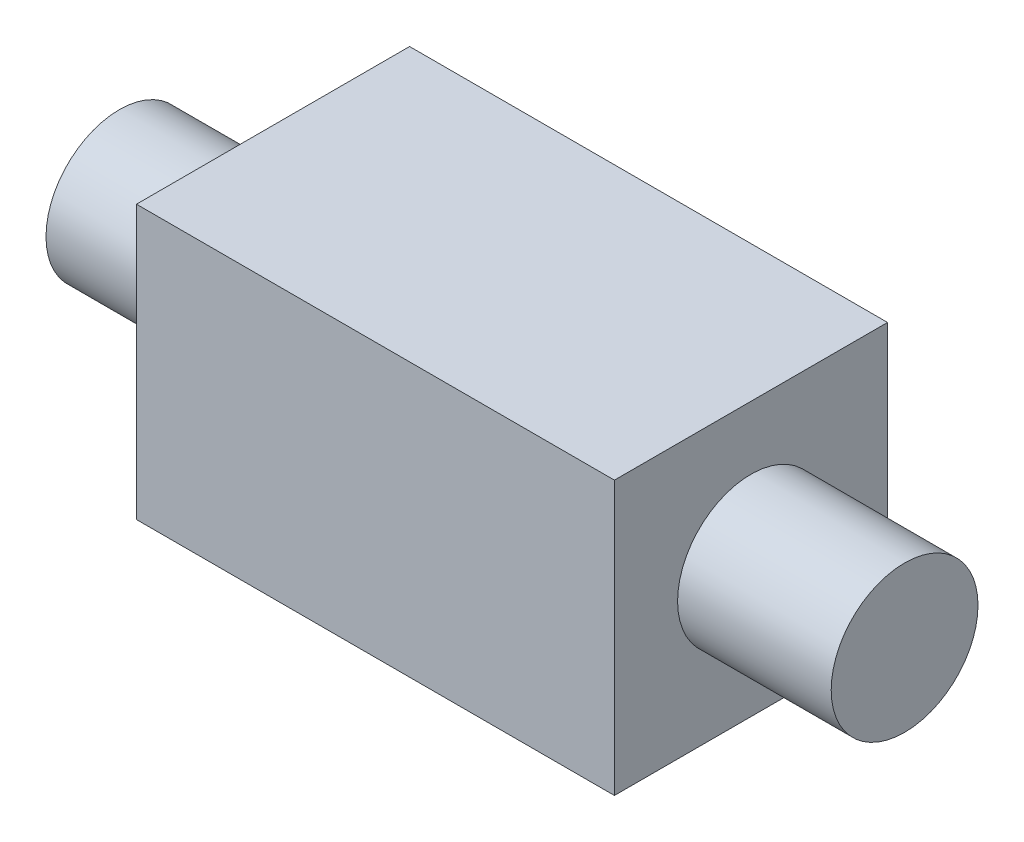
ISO-10303-21;
HEADER;
FILE_DESCRIPTION(('STEP AP214'),'2;1');
FILE_NAME('part.step','',(''),(''),'','','');
FILE_SCHEMA(('AUTOMOTIVE_DESIGN { 1 0 10303 214 1 1 1 1 }'));
ENDSEC;
DATA;
#1=APPLICATION_CONTEXT('core data for automotive mechanical design processes');
#2=APPLICATION_PROTOCOL_DEFINITION('international standard','automotive_design',2000,#1);
#3=PRODUCT_CONTEXT('',#1,'mechanical');
#4=PRODUCT('Part','Part','',(#3));
#5=PRODUCT_RELATED_PRODUCT_CATEGORY('part','',(#4));
#6=PRODUCT_DEFINITION_FORMATION('','',#4);
#7=PRODUCT_DEFINITION_CONTEXT('part definition',#1,'design');
#8=PRODUCT_DEFINITION('design','',#6,#7);
#9=PRODUCT_DEFINITION_SHAPE('','',#8);
#10=(LENGTH_UNIT() NAMED_UNIT(*) SI_UNIT(.MILLI.,.METRE.));
#11=(NAMED_UNIT(*) PLANE_ANGLE_UNIT() SI_UNIT($,.RADIAN.));
#12=(NAMED_UNIT(*) SI_UNIT($,.STERADIAN.) SOLID_ANGLE_UNIT());
#13=UNCERTAINTY_MEASURE_WITH_UNIT(LENGTH_MEASURE(1.E-05),#10,'distance_accuracy_value','');
#14=(GEOMETRIC_REPRESENTATION_CONTEXT(3) GLOBAL_UNCERTAINTY_ASSIGNED_CONTEXT((#13)) GLOBAL_UNIT_ASSIGNED_CONTEXT((#10,
#11,#12)) REPRESENTATION_CONTEXT('',''));
#15=CARTESIAN_POINT('',(0.,0.,0.));
#16=DIRECTION('',(0.,0.,1.));
#17=DIRECTION('',(1.,0.,0.));
#18=AXIS2_PLACEMENT_3D('',#15,#16,#17);
#19=CARTESIAN_POINT('',(10.8051948051948,8.,-9.67532467532467));
#20=DIRECTION('',(1.,0.,0.));
#21=DIRECTION('',(0.,0.,-1.));
#22=AXIS2_PLACEMENT_3D('',#19,#20,#21);
#23=PLANE('',#22);
#24=DIRECTION('',(0.,0.,1.));
#25=VECTOR('',#24,1.);
#26=CARTESIAN_POINT('',(10.8051948051948,0.,-9.67532467532467));
#27=LINE('',#26,#25);
#28=CARTESIAN_POINT('',(10.8051948051948,0.,-9.67532467532467));
#29=VERTEX_POINT('',#28);
#30=CARTESIAN_POINT('',(10.8051948051948,0.,-1.67532467532467));
#31=VERTEX_POINT('',#30);
#32=EDGE_CURVE('E101',#29,#31,#27,.T.);
#33=ORIENTED_EDGE('',*,*,#32,.T.);
#34=DIRECTION('',(0.,-1.,0.));
#35=VECTOR('',#34,1.);
#36=CARTESIAN_POINT('',(10.8051948051948,8.,-1.67532467532467));
#37=LINE('',#36,#35);
#38=CARTESIAN_POINT('',(10.8051948051948,8.,-1.67532467532467));
#39=VERTEX_POINT('',#38);
#40=EDGE_CURVE('E91',#39,#31,#37,.T.);
#41=ORIENTED_EDGE('',*,*,#40,.F.);
#42=DIRECTION('',(0.,0.,1.));
#43=VECTOR('',#42,1.);
#44=CARTESIAN_POINT('',(10.8051948051948,8.,-9.67532467532467));
#45=LINE('',#44,#43);
#46=CARTESIAN_POINT('',(10.8051948051948,8.,-9.67532467532467));
#47=VERTEX_POINT('',#46);
#48=EDGE_CURVE('E85',#47,#39,#45,.T.);
#49=ORIENTED_EDGE('',*,*,#48,.F.);
#50=DIRECTION('',(0.,-1.,0.));
#51=VECTOR('',#50,1.);
#52=CARTESIAN_POINT('',(10.8051948051948,8.,-9.67532467532467));
#53=LINE('',#52,#51);
#54=EDGE_CURVE('E97',#47,#29,#53,.T.);
#55=ORIENTED_EDGE('',*,*,#54,.T.);
#56=EDGE_LOOP('',(#33,#41,#49,#55));
#57=FACE_BOUND('',#56,.T.);
#58=CARTESIAN_POINT('',(10.8051948051948,4.,-5.67532467532467));
#59=DIRECTION('',(1.,0.,0.));
#60=DIRECTION('',(0.,0.,-1.));
#61=AXIS2_PLACEMENT_3D('',#58,#59,#60);
#62=CIRCLE('',#61,2.15);
#63=CARTESIAN_POINT('',(10.8051948051948,4.,-7.82532467532467));
#64=VERTEX_POINT('',#63);
#65=EDGE_CURVE('E11',#64,#64,#62,.F.);
#66=ORIENTED_EDGE('',*,*,#65,.F.);
#67=EDGE_LOOP('',(#66));
#68=FACE_BOUND('',#67,.T.);
#69=ADVANCED_FACE('F33',(#57,#68),#23,.F.);
#70=CARTESIAN_POINT('',(24.8051948051948,8.,-9.67532467532467));
#71=DIRECTION('',(-1.,0.,0.));
#72=DIRECTION('',(0.,0.,1.));
#73=AXIS2_PLACEMENT_3D('',#70,#71,#72);
#74=PLANE('',#73);
#75=DIRECTION('',(0.,0.,-1.));
#76=VECTOR('',#75,1.);
#77=CARTESIAN_POINT('',(24.8051948051948,0.,-9.67532467532467));
#78=LINE('',#77,#76);
#79=CARTESIAN_POINT('',(24.8051948051948,0.,-1.67532467532467));
#80=VERTEX_POINT('',#79);
#81=CARTESIAN_POINT('',(24.8051948051948,0.,-9.67532467532467));
#82=VERTEX_POINT('',#81);
#83=EDGE_CURVE('E66',#80,#82,#78,.T.);
#84=ORIENTED_EDGE('',*,*,#83,.T.);
#85=DIRECTION('',(0.,-1.,0.));
#86=VECTOR('',#85,1.);
#87=CARTESIAN_POINT('',(24.8051948051948,8.,-9.67532467532467));
#88=LINE('',#87,#86);
#89=CARTESIAN_POINT('',(24.8051948051948,8.,-9.67532467532467));
#90=VERTEX_POINT('',#89);
#91=EDGE_CURVE('E92',#90,#82,#88,.T.);
#92=ORIENTED_EDGE('',*,*,#91,.F.);
#93=DIRECTION('',(0.,0.,-1.));
#94=VECTOR('',#93,1.);
#95=CARTESIAN_POINT('',(24.8051948051948,8.,-9.67532467532467));
#96=LINE('',#95,#94);
#97=CARTESIAN_POINT('',(24.8051948051948,8.,-1.67532467532467));
#98=VERTEX_POINT('',#97);
#99=EDGE_CURVE('E83',#98,#90,#96,.T.);
#100=ORIENTED_EDGE('',*,*,#99,.F.);
#101=DIRECTION('',(0.,-1.,0.));
#102=VECTOR('',#101,1.);
#103=CARTESIAN_POINT('',(24.8051948051948,8.,-1.67532467532467));
#104=LINE('',#103,#102);
#105=EDGE_CURVE('E88',#98,#80,#104,.T.);
#106=ORIENTED_EDGE('',*,*,#105,.T.);
#107=EDGE_LOOP('',(#84,#92,#100,#106));
#108=FACE_BOUND('',#107,.T.);
#109=CARTESIAN_POINT('',(24.8051948051948,4.,-5.67532467532467));
#110=DIRECTION('',(-1.,0.,0.));
#111=DIRECTION('',(0.,0.,1.));
#112=AXIS2_PLACEMENT_3D('',#109,#110,#111);
#113=CIRCLE('',#112,2.15);
#114=CARTESIAN_POINT('',(24.8051948051948,4.,-3.52532467532467));
#115=VERTEX_POINT('',#114);
#116=EDGE_CURVE('E41',#115,#115,#113,.F.);
#117=ORIENTED_EDGE('',*,*,#116,.F.);
#118=EDGE_LOOP('',(#117));
#119=FACE_BOUND('',#118,.T.);
#120=ADVANCED_FACE('F94',(#108,#119),#74,.F.);
#121=CARTESIAN_POINT('',(10.8051948051948,8.,-1.67532467532467));
#122=DIRECTION('',(0.,0.,-1.));
#123=DIRECTION('',(-1.,0.,0.));
#124=AXIS2_PLACEMENT_3D('',#121,#122,#123);
#125=PLANE('',#124);
#126=DIRECTION('',(1.,0.,0.));
#127=VECTOR('',#126,1.);
#128=CARTESIAN_POINT('',(10.8051948051948,0.,-1.67532467532467));
#129=LINE('',#128,#127);
#130=EDGE_CURVE('E90',#31,#80,#129,.T.);
#131=ORIENTED_EDGE('',*,*,#130,.T.);
#132=ORIENTED_EDGE('',*,*,#105,.F.);
#133=DIRECTION('',(1.,0.,0.));
#134=VECTOR('',#133,1.);
#135=CARTESIAN_POINT('',(10.8051948051948,8.,-1.67532467532467));
#136=LINE('',#135,#134);
#137=EDGE_CURVE('E80',#39,#98,#136,.T.);
#138=ORIENTED_EDGE('',*,*,#137,.F.);
#139=ORIENTED_EDGE('',*,*,#40,.T.);
#140=EDGE_LOOP('',(#131,#132,#138,#139));
#141=FACE_BOUND('',#140,.T.);
#142=ADVANCED_FACE('F89',(#141),#125,.F.);
#143=CARTESIAN_POINT('',(10.8051948051948,8.,-9.67532467532467));
#144=DIRECTION('',(0.,0.,1.));
#145=DIRECTION('',(1.,0.,0.));
#146=AXIS2_PLACEMENT_3D('',#143,#144,#145);
#147=PLANE('',#146);
#148=DIRECTION('',(-1.,0.,0.));
#149=VECTOR('',#148,1.);
#150=CARTESIAN_POINT('',(10.8051948051948,0.,-9.67532467532467));
#151=LINE('',#150,#149);
#152=EDGE_CURVE('E72',#82,#29,#151,.T.);
#153=ORIENTED_EDGE('',*,*,#152,.T.);
#154=ORIENTED_EDGE('',*,*,#54,.F.);
#155=DIRECTION('',(-1.,0.,0.));
#156=VECTOR('',#155,1.);
#157=CARTESIAN_POINT('',(10.8051948051948,8.,-9.67532467532467));
#158=LINE('',#157,#156);
#159=EDGE_CURVE('E49',#90,#47,#158,.T.);
#160=ORIENTED_EDGE('',*,*,#159,.F.);
#161=ORIENTED_EDGE('',*,*,#91,.T.);
#162=EDGE_LOOP('',(#153,#154,#160,#161));
#163=FACE_BOUND('',#162,.T.);
#164=ADVANCED_FACE('F120',(#163),#147,.F.);
#165=CARTESIAN_POINT('',(0.,8.,0.));
#166=DIRECTION('',(0.,1.,0.));
#167=DIRECTION('',(0.,0.,1.));
#168=AXIS2_PLACEMENT_3D('',#165,#166,#167);
#169=PLANE('',#168);
#170=ORIENTED_EDGE('',*,*,#48,.T.);
#171=ORIENTED_EDGE('',*,*,#137,.T.);
#172=ORIENTED_EDGE('',*,*,#99,.T.);
#173=ORIENTED_EDGE('',*,*,#159,.T.);
#174=EDGE_LOOP('',(#170,#171,#172,#173));
#175=FACE_BOUND('',#174,.T.);
#176=ADVANCED_FACE('F81',(#175),#169,.T.);
#177=CARTESIAN_POINT('',(0.,0.,0.));
#178=DIRECTION('',(0.,1.,0.));
#179=DIRECTION('',(0.,0.,1.));
#180=AXIS2_PLACEMENT_3D('',#177,#178,#179);
#181=PLANE('',#180);
#182=ORIENTED_EDGE('',*,*,#32,.F.);
#183=ORIENTED_EDGE('',*,*,#152,.F.);
#184=ORIENTED_EDGE('',*,*,#83,.F.);
#185=ORIENTED_EDGE('',*,*,#130,.F.);
#186=EDGE_LOOP('',(#182,#183,#184,#185));
#187=FACE_BOUND('',#186,.T.);
#188=ADVANCED_FACE('F125',(#187),#181,.F.);
#189=CARTESIAN_POINT('',(29.3051948051948,4.,-5.67532467532467));
#190=DIRECTION('',(-1.,0.,0.));
#191=DIRECTION('',(0.,0.,1.));
#192=AXIS2_PLACEMENT_3D('',#189,#190,#191);
#193=CYLINDRICAL_SURFACE('',#192,2.15);
#194=CARTESIAN_POINT('',(29.3051948051948,4.,-5.67532467532467));
#195=DIRECTION('',(1.,0.,0.));
#196=DIRECTION('',(0.,0.,-1.));
#197=AXIS2_PLACEMENT_3D('',#194,#195,#196);
#198=CIRCLE('',#197,2.15);
#199=CARTESIAN_POINT('',(29.3051948051948,4.,-7.82532467532467));
#200=VERTEX_POINT('',#199);
#201=EDGE_CURVE('E104',#200,#200,#198,.T.);
#202=ORIENTED_EDGE('',*,*,#201,.F.);
#203=EDGE_LOOP('',(#202));
#204=FACE_BOUND('',#203,.T.);
#205=ORIENTED_EDGE('',*,*,#116,.T.);
#206=EDGE_LOOP('',(#205));
#207=FACE_BOUND('',#206,.T.);
#208=ADVANCED_FACE('F113',(#204,#207),#193,.T.);
#209=CARTESIAN_POINT('',(29.3051948051948,4.,-5.67532467532467));
#210=DIRECTION('',(1.,0.,0.));
#211=DIRECTION('',(0.,0.,-1.));
#212=AXIS2_PLACEMENT_3D('',#209,#210,#211);
#213=PLANE('',#212);
#214=ORIENTED_EDGE('',*,*,#201,.T.);
#215=EDGE_LOOP('',(#214));
#216=FACE_BOUND('',#215,.T.);
#217=ADVANCED_FACE('F133',(#216),#213,.T.);
#218=CARTESIAN_POINT('',(6.30519480519481,4.,-5.67532467532467));
#219=DIRECTION('',(1.,0.,0.));
#220=DIRECTION('',(0.,0.,-1.));
#221=AXIS2_PLACEMENT_3D('',#218,#219,#220);
#222=CYLINDRICAL_SURFACE('',#221,2.15);
#223=CARTESIAN_POINT('',(6.30519480519481,4.,-5.67532467532467));
#224=DIRECTION('',(-1.,0.,0.));
#225=DIRECTION('',(0.,0.,1.));
#226=AXIS2_PLACEMENT_3D('',#223,#224,#225);
#227=CIRCLE('',#226,2.15);
#228=CARTESIAN_POINT('',(6.30519480519481,4.,-3.52532467532467));
#229=VERTEX_POINT('',#228);
#230=EDGE_CURVE('E149',#229,#229,#227,.T.);
#231=ORIENTED_EDGE('',*,*,#230,.F.);
#232=EDGE_LOOP('',(#231));
#233=FACE_BOUND('',#232,.T.);
#234=ORIENTED_EDGE('',*,*,#65,.T.);
#235=EDGE_LOOP('',(#234));
#236=FACE_BOUND('',#235,.T.);
#237=ADVANCED_FACE('F137',(#233,#236),#222,.T.);
#238=CARTESIAN_POINT('',(6.30519480519481,4.,-5.67532467532467));
#239=DIRECTION('',(-1.,0.,0.));
#240=DIRECTION('',(0.,0.,1.));
#241=AXIS2_PLACEMENT_3D('',#238,#239,#240);
#242=PLANE('',#241);
#243=ORIENTED_EDGE('',*,*,#230,.T.);
#244=EDGE_LOOP('',(#243));
#245=FACE_BOUND('',#244,.T.);
#246=ADVANCED_FACE('F141',(#245),#242,.T.);
#247=CLOSED_SHELL('',(#69,#120,#142,#164,#176,#188,#208,#217,#237,#246));
#248=MANIFOLD_SOLID_BREP('B2',#247);
#249=ADVANCED_BREP_SHAPE_REPRESENTATION('',(#18,#248),#14);
#250=SHAPE_DEFINITION_REPRESENTATION(#9,#249);
ENDSEC;
END-ISO-10303-21;
